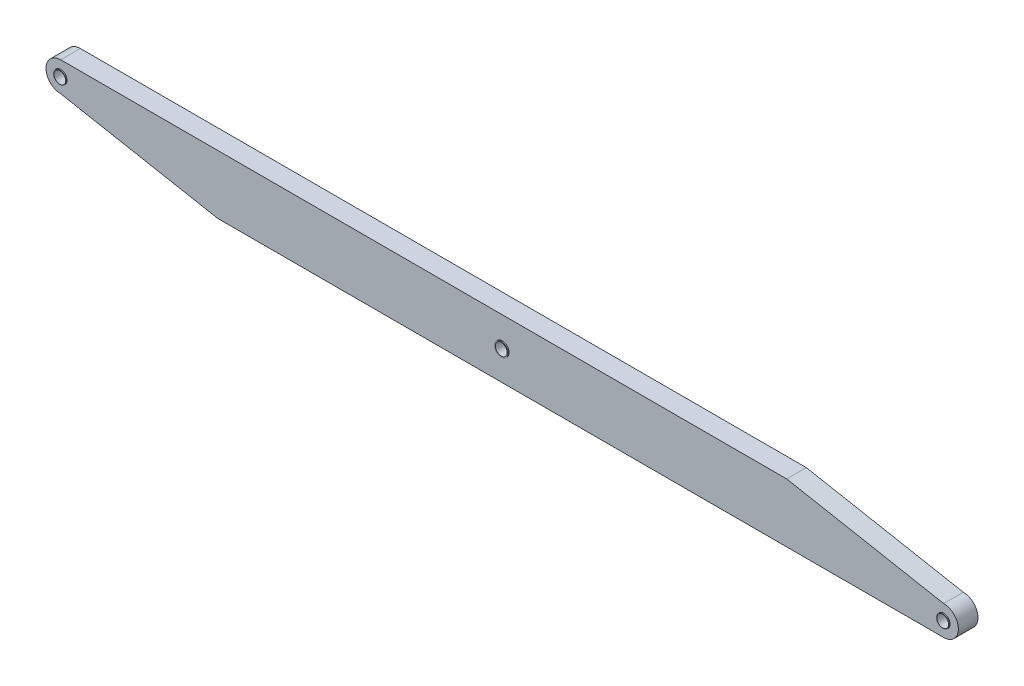
ISO-10303-21;
HEADER;
FILE_DESCRIPTION(('STEP AP214'),'2;1');
FILE_NAME('part.step','',(''),(''),'','','');
FILE_SCHEMA(('AUTOMOTIVE_DESIGN { 1 0 10303 214 1 1 1 1 }'));
ENDSEC;
DATA;
#1=APPLICATION_CONTEXT('core data for automotive mechanical design processes');
#2=APPLICATION_PROTOCOL_DEFINITION('international standard','automotive_design',2000,#1);
#3=PRODUCT_CONTEXT('',#1,'mechanical');
#4=PRODUCT('Part','Part','',(#3));
#5=PRODUCT_RELATED_PRODUCT_CATEGORY('part','',(#4));
#6=PRODUCT_DEFINITION_FORMATION('','',#4);
#7=PRODUCT_DEFINITION_CONTEXT('part definition',#1,'design');
#8=PRODUCT_DEFINITION('design','',#6,#7);
#9=PRODUCT_DEFINITION_SHAPE('','',#8);
#10=(LENGTH_UNIT() NAMED_UNIT(*) SI_UNIT(.MILLI.,.METRE.));
#11=(NAMED_UNIT(*) PLANE_ANGLE_UNIT() SI_UNIT($,.RADIAN.));
#12=(NAMED_UNIT(*) SI_UNIT($,.STERADIAN.) SOLID_ANGLE_UNIT());
#13=UNCERTAINTY_MEASURE_WITH_UNIT(LENGTH_MEASURE(1.E-05),#10,'distance_accuracy_value','');
#14=(GEOMETRIC_REPRESENTATION_CONTEXT(3) GLOBAL_UNCERTAINTY_ASSIGNED_CONTEXT((#13)) GLOBAL_UNIT_ASSIGNED_CONTEXT((#10,
#11,#12)) REPRESENTATION_CONTEXT('',''));
#15=CARTESIAN_POINT('',(0.,0.,0.));
#16=DIRECTION('',(0.,0.,1.));
#17=DIRECTION('',(1.,0.,0.));
#18=AXIS2_PLACEMENT_3D('',#15,#16,#17);
#19=CARTESIAN_POINT('',(1413.61764890017,-101.658248730964,67.25));
#20=DIRECTION('',(0.,0.,1.));
#21=DIRECTION('',(1.,0.,0.));
#22=AXIS2_PLACEMENT_3D('',#19,#20,#21);
#23=PLANE('',#22);
#24=CARTESIAN_POINT('',(2966.11764890017,-153.408248730964,67.25));
#25=DIRECTION('',(0.,0.,1.));
#26=DIRECTION('',(1.,0.,0.));
#27=AXIS2_PLACEMENT_3D('',#24,#25,#26);
#28=CIRCLE('',#27,11.2125);
#29=CARTESIAN_POINT('',(2977.33014890017,-153.408248730964,67.25));
#30=VERTEX_POINT('',#29);
#31=EDGE_CURVE('E228',#30,#30,#28,.T.);
#32=ORIENTED_EDGE('',*,*,#31,.F.);
#33=EDGE_LOOP('',(#32));
#34=FACE_BOUND('',#33,.T.);
#35=CARTESIAN_POINT('',(1413.61764890017,-101.658248730964,67.25));
#36=DIRECTION('',(0.,0.,1.));
#37=DIRECTION('',(1.,0.,0.));
#38=AXIS2_PLACEMENT_3D('',#35,#36,#37);
#39=CIRCLE('',#38,25.875);
#40=CARTESIAN_POINT('',(1413.61764890017,-75.7832487309645,67.25));
#41=VERTEX_POINT('',#40);
#42=CARTESIAN_POINT('',(1413.61764890017,-127.533248730964,67.25));
#43=VERTEX_POINT('',#42);
#44=EDGE_CURVE('E132',#41,#43,#39,.T.);
#45=ORIENTED_EDGE('',*,*,#44,.T.);
#46=DIRECTION('',(0.982872186934322,-0.184288535050185,0.));
#47=VECTOR('',#46,1.);
#48=CARTESIAN_POINT('',(1413.61764890017,-127.533248730964,67.25));
#49=LINE('',#48,#47);
#50=CARTESIAN_POINT('',(1689.61764890017,-179.283248730964,67.25));
#51=VERTEX_POINT('',#50);
#52=EDGE_CURVE('E90',#43,#51,#49,.T.);
#53=ORIENTED_EDGE('',*,*,#52,.T.);
#54=DIRECTION('',(1.,0.,0.));
#55=VECTOR('',#54,1.);
#56=CARTESIAN_POINT('',(1689.61764890017,-179.283248730964,67.25));
#57=LINE('',#56,#55);
#58=CARTESIAN_POINT('',(2966.11764890017,-179.283248730964,67.25));
#59=VERTEX_POINT('',#58);
#60=EDGE_CURVE('E103',#51,#59,#57,.T.);
#61=ORIENTED_EDGE('',*,*,#60,.T.);
#62=CARTESIAN_POINT('',(2966.11764890017,-153.408248730964,67.25));
#63=DIRECTION('',(0.,0.,1.));
#64=DIRECTION('',(1.,0.,0.));
#65=AXIS2_PLACEMENT_3D('',#62,#63,#64);
#66=CIRCLE('',#65,25.875);
#67=CARTESIAN_POINT('',(2966.11764890017,-127.533248730964,67.25));
#68=VERTEX_POINT('',#67);
#69=EDGE_CURVE('E97',#59,#68,#66,.T.);
#70=ORIENTED_EDGE('',*,*,#69,.T.);
#71=DIRECTION('',(-0.982872186934322,0.184288535050185,0.));
#72=VECTOR('',#71,1.);
#73=CARTESIAN_POINT('',(2966.11764890017,-127.533248730964,67.25));
#74=LINE('',#73,#72);
#75=CARTESIAN_POINT('',(2690.11764890017,-75.7832487309645,67.25));
#76=VERTEX_POINT('',#75);
#77=EDGE_CURVE('E101',#68,#76,#74,.T.);
#78=ORIENTED_EDGE('',*,*,#77,.T.);
#79=DIRECTION('',(-1.,0.,0.));
#80=VECTOR('',#79,1.);
#81=CARTESIAN_POINT('',(1413.61764890017,-75.7832487309645,67.25));
#82=LINE('',#81,#80);
#83=EDGE_CURVE('E52',#76,#41,#82,.T.);
#84=ORIENTED_EDGE('',*,*,#83,.T.);
#85=EDGE_LOOP('',(#45,#53,#61,#70,#78,#84));
#86=FACE_BOUND('',#85,.T.);
#87=CARTESIAN_POINT('',(1413.61764890017,-101.658248730964,67.25));
#88=DIRECTION('',(0.,0.,1.));
#89=DIRECTION('',(1.,0.,0.));
#90=AXIS2_PLACEMENT_3D('',#87,#88,#89);
#91=CIRCLE('',#90,11.2125);
#92=CARTESIAN_POINT('',(1424.83014890017,-101.658248730964,67.25));
#93=VERTEX_POINT('',#92);
#94=EDGE_CURVE('E219',#93,#93,#91,.T.);
#95=ORIENTED_EDGE('',*,*,#94,.F.);
#96=EDGE_LOOP('',(#95));
#97=FACE_BOUND('',#96,.T.);
#98=CARTESIAN_POINT('',(2189.86764890017,-127.533248730964,67.25));
#99=DIRECTION('',(0.,0.,1.));
#100=DIRECTION('',(1.,0.,0.));
#101=AXIS2_PLACEMENT_3D('',#98,#99,#100);
#102=CIRCLE('',#101,12.0749999999999);
#103=CARTESIAN_POINT('',(2201.94264890017,-127.533248730964,67.25));
#104=VERTEX_POINT('',#103);
#105=EDGE_CURVE('E243',#104,#104,#102,.T.);
#106=ORIENTED_EDGE('',*,*,#105,.F.);
#107=EDGE_LOOP('',(#106));
#108=FACE_BOUND('',#107,.T.);
#109=ADVANCED_FACE('F35',(#34,#86,#97,#108),#23,.T.);
#110=CARTESIAN_POINT('',(1413.61764890017,-101.658248730964,32.75));
#111=DIRECTION('',(0.,0.,1.));
#112=DIRECTION('',(1.,0.,0.));
#113=AXIS2_PLACEMENT_3D('',#110,#111,#112);
#114=PLANE('',#113);
#115=CARTESIAN_POINT('',(1413.61764890017,-101.658248730964,32.75));
#116=DIRECTION('',(0.,0.,1.));
#117=DIRECTION('',(1.,0.,0.));
#118=AXIS2_PLACEMENT_3D('',#115,#116,#117);
#119=CIRCLE('',#118,11.2125);
#120=CARTESIAN_POINT('',(1424.83014890017,-101.658248730964,32.75));
#121=VERTEX_POINT('',#120);
#122=EDGE_CURVE('E44',#121,#121,#119,.F.);
#123=ORIENTED_EDGE('',*,*,#122,.F.);
#124=EDGE_LOOP('',(#123));
#125=FACE_BOUND('',#124,.T.);
#126=CARTESIAN_POINT('',(1413.61764890017,-101.658248730964,32.75));
#127=DIRECTION('',(0.,0.,1.));
#128=DIRECTION('',(1.,0.,0.));
#129=AXIS2_PLACEMENT_3D('',#126,#127,#128);
#130=CIRCLE('',#129,25.875);
#131=CARTESIAN_POINT('',(1413.61764890017,-75.7832487309645,32.75));
#132=VERTEX_POINT('',#131);
#133=CARTESIAN_POINT('',(1413.61764890017,-127.533248730964,32.75));
#134=VERTEX_POINT('',#133);
#135=EDGE_CURVE('E121',#132,#134,#130,.T.);
#136=ORIENTED_EDGE('',*,*,#135,.F.);
#137=DIRECTION('',(-1.,0.,0.));
#138=VECTOR('',#137,1.);
#139=CARTESIAN_POINT('',(1413.61764890017,-75.7832487309645,32.75));
#140=LINE('',#139,#138);
#141=CARTESIAN_POINT('',(2690.11764890017,-75.7832487309645,32.75));
#142=VERTEX_POINT('',#141);
#143=EDGE_CURVE('E81',#142,#132,#140,.T.);
#144=ORIENTED_EDGE('',*,*,#143,.F.);
#145=DIRECTION('',(-0.982872186934322,0.184288535050185,0.));
#146=VECTOR('',#145,1.);
#147=CARTESIAN_POINT('',(2966.11764890017,-127.533248730964,32.75));
#148=LINE('',#147,#146);
#149=CARTESIAN_POINT('',(2966.11764890017,-127.533248730964,32.75));
#150=VERTEX_POINT('',#149);
#151=EDGE_CURVE('E75',#150,#142,#148,.T.);
#152=ORIENTED_EDGE('',*,*,#151,.F.);
#153=CARTESIAN_POINT('',(2966.11764890017,-153.408248730964,32.75));
#154=DIRECTION('',(0.,0.,1.));
#155=DIRECTION('',(1.,0.,0.));
#156=AXIS2_PLACEMENT_3D('',#153,#154,#155);
#157=CIRCLE('',#156,25.875);
#158=CARTESIAN_POINT('',(2966.11764890017,-179.283248730964,32.75));
#159=VERTEX_POINT('',#158);
#160=EDGE_CURVE('E111',#159,#150,#157,.T.);
#161=ORIENTED_EDGE('',*,*,#160,.F.);
#162=DIRECTION('',(1.,0.,0.));
#163=VECTOR('',#162,1.);
#164=CARTESIAN_POINT('',(1689.61764890017,-179.283248730964,32.75));
#165=LINE('',#164,#163);
#166=CARTESIAN_POINT('',(1689.61764890017,-179.283248730964,32.75));
#167=VERTEX_POINT('',#166);
#168=EDGE_CURVE('E127',#167,#159,#165,.T.);
#169=ORIENTED_EDGE('',*,*,#168,.F.);
#170=DIRECTION('',(0.982872186934322,-0.184288535050185,0.));
#171=VECTOR('',#170,1.);
#172=CARTESIAN_POINT('',(1413.61764890017,-127.533248730964,32.75));
#173=LINE('',#172,#171);
#174=EDGE_CURVE('E124',#134,#167,#173,.T.);
#175=ORIENTED_EDGE('',*,*,#174,.F.);
#176=EDGE_LOOP('',(#136,#144,#152,#161,#169,#175));
#177=FACE_BOUND('',#176,.T.);
#178=CARTESIAN_POINT('',(2966.11764890017,-153.408248730964,32.75));
#179=DIRECTION('',(0.,0.,1.));
#180=DIRECTION('',(1.,0.,0.));
#181=AXIS2_PLACEMENT_3D('',#178,#179,#180);
#182=CIRCLE('',#181,11.2125);
#183=CARTESIAN_POINT('',(2977.33014890017,-153.408248730964,32.75));
#184=VERTEX_POINT('',#183);
#185=EDGE_CURVE('E141',#184,#184,#182,.F.);
#186=ORIENTED_EDGE('',*,*,#185,.F.);
#187=EDGE_LOOP('',(#186));
#188=FACE_BOUND('',#187,.T.);
#189=CARTESIAN_POINT('',(2189.86764890017,-127.533248730964,32.75));
#190=DIRECTION('',(0.,0.,1.));
#191=DIRECTION('',(1.,0.,0.));
#192=AXIS2_PLACEMENT_3D('',#189,#190,#191);
#193=CIRCLE('',#192,12.0749999999999);
#194=CARTESIAN_POINT('',(2201.94264890017,-127.533248730964,32.75));
#195=VERTEX_POINT('',#194);
#196=EDGE_CURVE('E11',#195,#195,#193,.F.);
#197=ORIENTED_EDGE('',*,*,#196,.F.);
#198=EDGE_LOOP('',(#197));
#199=FACE_BOUND('',#198,.T.);
#200=ADVANCED_FACE('F148',(#125,#177,#188,#199),#114,.F.);
#201=CARTESIAN_POINT('',(1413.61764890017,-101.658248730964,67.25));
#202=DIRECTION('',(0.,0.,-1.));
#203=DIRECTION('',(-1.,0.,0.));
#204=AXIS2_PLACEMENT_3D('',#201,#202,#203);
#205=CYLINDRICAL_SURFACE('',#204,25.875);
#206=ORIENTED_EDGE('',*,*,#135,.T.);
#207=DIRECTION('',(0.,0.,-1.));
#208=VECTOR('',#207,1.);
#209=CARTESIAN_POINT('',(1413.61764890017,-127.533248730964,67.25));
#210=LINE('',#209,#208);
#211=EDGE_CURVE('E139',#43,#134,#210,.T.);
#212=ORIENTED_EDGE('',*,*,#211,.F.);
#213=ORIENTED_EDGE('',*,*,#44,.F.);
#214=DIRECTION('',(0.,0.,-1.));
#215=VECTOR('',#214,1.);
#216=CARTESIAN_POINT('',(1413.61764890017,-75.7832487309645,67.25));
#217=LINE('',#216,#215);
#218=EDGE_CURVE('E117',#41,#132,#217,.T.);
#219=ORIENTED_EDGE('',*,*,#218,.T.);
#220=EDGE_LOOP('',(#206,#212,#213,#219));
#221=FACE_BOUND('',#220,.T.);
#222=ADVANCED_FACE('F37',(#221),#205,.T.);
#223=CARTESIAN_POINT('',(1413.61764890017,-127.533248730964,67.25));
#224=DIRECTION('',(0.184288535050185,0.982872186934322,0.));
#225=DIRECTION('',(-0.982872186934322,0.184288535050185,0.));
#226=AXIS2_PLACEMENT_3D('',#223,#224,#225);
#227=PLANE('',#226);
#228=ORIENTED_EDGE('',*,*,#174,.T.);
#229=DIRECTION('',(0.,0.,-1.));
#230=VECTOR('',#229,1.);
#231=CARTESIAN_POINT('',(1689.61764890017,-179.283248730964,67.25));
#232=LINE('',#231,#230);
#233=EDGE_CURVE('E136',#51,#167,#232,.T.);
#234=ORIENTED_EDGE('',*,*,#233,.F.);
#235=ORIENTED_EDGE('',*,*,#52,.F.);
#236=ORIENTED_EDGE('',*,*,#211,.T.);
#237=EDGE_LOOP('',(#228,#234,#235,#236));
#238=FACE_BOUND('',#237,.T.);
#239=ADVANCED_FACE('F195',(#238),#227,.F.);
#240=CARTESIAN_POINT('',(1689.61764890017,-179.283248730964,67.25));
#241=DIRECTION('',(0.,1.,0.));
#242=DIRECTION('',(0.,0.,1.));
#243=AXIS2_PLACEMENT_3D('',#240,#241,#242);
#244=PLANE('',#243);
#245=ORIENTED_EDGE('',*,*,#168,.T.);
#246=DIRECTION('',(0.,0.,-1.));
#247=VECTOR('',#246,1.);
#248=CARTESIAN_POINT('',(2966.11764890017,-179.283248730964,67.25));
#249=LINE('',#248,#247);
#250=EDGE_CURVE('E112',#59,#159,#249,.T.);
#251=ORIENTED_EDGE('',*,*,#250,.F.);
#252=ORIENTED_EDGE('',*,*,#60,.F.);
#253=ORIENTED_EDGE('',*,*,#233,.T.);
#254=EDGE_LOOP('',(#245,#251,#252,#253));
#255=FACE_BOUND('',#254,.T.);
#256=ADVANCED_FACE('F193',(#255),#244,.F.);
#257=CARTESIAN_POINT('',(2966.11764890017,-153.408248730964,67.25));
#258=DIRECTION('',(0.,0.,-1.));
#259=DIRECTION('',(-1.,0.,0.));
#260=AXIS2_PLACEMENT_3D('',#257,#258,#259);
#261=CYLINDRICAL_SURFACE('',#260,25.875);
#262=ORIENTED_EDGE('',*,*,#160,.T.);
#263=DIRECTION('',(0.,0.,-1.));
#264=VECTOR('',#263,1.);
#265=CARTESIAN_POINT('',(2966.11764890017,-127.533248730964,67.25));
#266=LINE('',#265,#264);
#267=EDGE_CURVE('E108',#68,#150,#266,.T.);
#268=ORIENTED_EDGE('',*,*,#267,.F.);
#269=ORIENTED_EDGE('',*,*,#69,.F.);
#270=ORIENTED_EDGE('',*,*,#250,.T.);
#271=EDGE_LOOP('',(#262,#268,#269,#270));
#272=FACE_BOUND('',#271,.T.);
#273=ADVANCED_FACE('F109',(#272),#261,.T.);
#274=CARTESIAN_POINT('',(2966.11764890017,-127.533248730964,67.25));
#275=DIRECTION('',(-0.184288535050185,-0.982872186934322,0.));
#276=DIRECTION('',(0.982872186934322,-0.184288535050185,0.));
#277=AXIS2_PLACEMENT_3D('',#274,#275,#276);
#278=PLANE('',#277);
#279=ORIENTED_EDGE('',*,*,#151,.T.);
#280=DIRECTION('',(0.,0.,-1.));
#281=VECTOR('',#280,1.);
#282=CARTESIAN_POINT('',(2690.11764890017,-75.7832487309645,67.25));
#283=LINE('',#282,#281);
#284=EDGE_CURVE('E113',#76,#142,#283,.T.);
#285=ORIENTED_EDGE('',*,*,#284,.F.);
#286=ORIENTED_EDGE('',*,*,#77,.F.);
#287=ORIENTED_EDGE('',*,*,#267,.T.);
#288=EDGE_LOOP('',(#279,#285,#286,#287));
#289=FACE_BOUND('',#288,.T.);
#290=ADVANCED_FACE('F115',(#289),#278,.F.);
#291=CARTESIAN_POINT('',(1413.61764890017,-75.7832487309645,67.25));
#292=DIRECTION('',(0.,-1.,0.));
#293=DIRECTION('',(1.,0.,0.));
#294=AXIS2_PLACEMENT_3D('',#291,#292,#293);
#295=PLANE('',#294);
#296=ORIENTED_EDGE('',*,*,#143,.T.);
#297=ORIENTED_EDGE('',*,*,#218,.F.);
#298=ORIENTED_EDGE('',*,*,#83,.F.);
#299=ORIENTED_EDGE('',*,*,#284,.T.);
#300=EDGE_LOOP('',(#296,#297,#298,#299));
#301=FACE_BOUND('',#300,.T.);
#302=ADVANCED_FACE('F186',(#301),#295,.F.);
#303=CARTESIAN_POINT('',(1413.61764890017,-101.658248730964,32.75));
#304=DIRECTION('',(0.,0.,1.));
#305=DIRECTION('',(1.,0.,0.));
#306=AXIS2_PLACEMENT_3D('',#303,#304,#305);
#307=CYLINDRICAL_SURFACE('',#306,10.35);
#308=CARTESIAN_POINT('',(1413.61764890017,-101.658248730964,31.025));
#309=DIRECTION('',(0.,0.,-1.));
#310=DIRECTION('',(-1.,0.,0.));
#311=AXIS2_PLACEMENT_3D('',#308,#309,#310);
#312=CIRCLE('',#311,10.35);
#313=CARTESIAN_POINT('',(1403.26764890017,-101.658248730964,31.025));
#314=VERTEX_POINT('',#313);
#315=EDGE_CURVE('E215',#314,#314,#312,.T.);
#316=ORIENTED_EDGE('',*,*,#315,.T.);
#317=EDGE_LOOP('',(#316));
#318=FACE_BOUND('',#317,.T.);
#319=CARTESIAN_POINT('',(1413.61764890017,-101.658248730964,68.975));
#320=DIRECTION('',(0.,0.,1.));
#321=DIRECTION('',(1.,0.,0.));
#322=AXIS2_PLACEMENT_3D('',#319,#320,#321);
#323=CIRCLE('',#322,10.35);
#324=CARTESIAN_POINT('',(1423.96764890017,-101.658248730964,68.975));
#325=VERTEX_POINT('',#324);
#326=EDGE_CURVE('E222',#325,#325,#323,.T.);
#327=ORIENTED_EDGE('',*,*,#326,.T.);
#328=EDGE_LOOP('',(#327));
#329=FACE_BOUND('',#328,.T.);
#330=ADVANCED_FACE('F183',(#318,#329),#307,.F.);
#331=CARTESIAN_POINT('',(2966.11764890017,-153.408248730964,32.75));
#332=DIRECTION('',(0.,0.,1.));
#333=DIRECTION('',(1.,0.,0.));
#334=AXIS2_PLACEMENT_3D('',#331,#332,#333);
#335=CYLINDRICAL_SURFACE('',#334,10.3499999999999);
#336=CARTESIAN_POINT('',(2966.11764890017,-153.408248730964,31.025));
#337=DIRECTION('',(0.,0.,-1.));
#338=DIRECTION('',(-1.,0.,0.));
#339=AXIS2_PLACEMENT_3D('',#336,#337,#338);
#340=CIRCLE('',#339,10.35);
#341=CARTESIAN_POINT('',(2955.76764890017,-153.408248730964,31.025));
#342=VERTEX_POINT('',#341);
#343=EDGE_CURVE('E209',#342,#342,#340,.T.);
#344=ORIENTED_EDGE('',*,*,#343,.T.);
#345=EDGE_LOOP('',(#344));
#346=FACE_BOUND('',#345,.T.);
#347=CARTESIAN_POINT('',(2966.11764890017,-153.408248730964,68.975));
#348=DIRECTION('',(0.,0.,1.));
#349=DIRECTION('',(1.,0.,0.));
#350=AXIS2_PLACEMENT_3D('',#347,#348,#349);
#351=CIRCLE('',#350,10.35);
#352=CARTESIAN_POINT('',(2976.46764890017,-153.408248730964,68.975));
#353=VERTEX_POINT('',#352);
#354=EDGE_CURVE('E231',#353,#353,#351,.T.);
#355=ORIENTED_EDGE('',*,*,#354,.T.);
#356=EDGE_LOOP('',(#355));
#357=FACE_BOUND('',#356,.T.);
#358=ADVANCED_FACE('F285',(#346,#357),#335,.F.);
#359=CARTESIAN_POINT('',(2966.11764890017,-153.408248730964,31.025));
#360=DIRECTION('',(0.,0.,-1.));
#361=DIRECTION('',(-1.,0.,0.));
#362=AXIS2_PLACEMENT_3D('',#359,#360,#361);
#363=PLANE('',#362);
#364=CARTESIAN_POINT('',(2966.11764890017,-153.408248730964,31.025));
#365=DIRECTION('',(0.,0.,-1.));
#366=DIRECTION('',(-1.,0.,0.));
#367=AXIS2_PLACEMENT_3D('',#364,#365,#366);
#368=CIRCLE('',#367,11.2125);
#369=CARTESIAN_POINT('',(2954.90514890017,-153.408248730964,31.025));
#370=VERTEX_POINT('',#369);
#371=EDGE_CURVE('E125',#370,#370,#368,.T.);
#372=ORIENTED_EDGE('',*,*,#371,.T.);
#373=EDGE_LOOP('',(#372));
#374=FACE_BOUND('',#373,.T.);
#375=ORIENTED_EDGE('',*,*,#343,.F.);
#376=EDGE_LOOP('',(#375));
#377=FACE_BOUND('',#376,.T.);
#378=ADVANCED_FACE('F282',(#374,#377),#363,.T.);
#379=CARTESIAN_POINT('',(2966.11764890017,-153.408248730964,31.025));
#380=DIRECTION('',(0.,0.,1.));
#381=DIRECTION('',(1.,0.,0.));
#382=AXIS2_PLACEMENT_3D('',#379,#380,#381);
#383=CYLINDRICAL_SURFACE('',#382,11.2125);
#384=ORIENTED_EDGE('',*,*,#371,.F.);
#385=EDGE_LOOP('',(#384));
#386=FACE_BOUND('',#385,.T.);
#387=ORIENTED_EDGE('',*,*,#185,.T.);
#388=EDGE_LOOP('',(#387));
#389=FACE_BOUND('',#388,.T.);
#390=ADVANCED_FACE('F277',(#386,#389),#383,.T.);
#391=CARTESIAN_POINT('',(1413.61764890017,-101.658248730964,31.025));
#392=DIRECTION('',(0.,0.,-1.));
#393=DIRECTION('',(-1.,0.,0.));
#394=AXIS2_PLACEMENT_3D('',#391,#392,#393);
#395=PLANE('',#394);
#396=CARTESIAN_POINT('',(1413.61764890017,-101.658248730964,31.025));
#397=DIRECTION('',(0.,0.,-1.));
#398=DIRECTION('',(-1.,0.,0.));
#399=AXIS2_PLACEMENT_3D('',#396,#397,#398);
#400=CIRCLE('',#399,11.2125);
#401=CARTESIAN_POINT('',(1402.40514890017,-101.658248730964,31.025));
#402=VERTEX_POINT('',#401);
#403=EDGE_CURVE('E212',#402,#402,#400,.T.);
#404=ORIENTED_EDGE('',*,*,#403,.T.);
#405=EDGE_LOOP('',(#404));
#406=FACE_BOUND('',#405,.T.);
#407=ORIENTED_EDGE('',*,*,#315,.F.);
#408=EDGE_LOOP('',(#407));
#409=FACE_BOUND('',#408,.T.);
#410=ADVANCED_FACE('F274',(#406,#409),#395,.T.);
#411=CARTESIAN_POINT('',(1413.61764890017,-101.658248730964,31.025));
#412=DIRECTION('',(0.,0.,1.));
#413=DIRECTION('',(1.,0.,0.));
#414=AXIS2_PLACEMENT_3D('',#411,#412,#413);
#415=CYLINDRICAL_SURFACE('',#414,11.2125);
#416=ORIENTED_EDGE('',*,*,#403,.F.);
#417=EDGE_LOOP('',(#416));
#418=FACE_BOUND('',#417,.T.);
#419=ORIENTED_EDGE('',*,*,#122,.T.);
#420=EDGE_LOOP('',(#419));
#421=FACE_BOUND('',#420,.T.);
#422=ADVANCED_FACE('F146',(#418,#421),#415,.T.);
#423=CARTESIAN_POINT('',(1413.61764890017,-101.658248730964,68.975));
#424=DIRECTION('',(0.,0.,1.));
#425=DIRECTION('',(1.,0.,0.));
#426=AXIS2_PLACEMENT_3D('',#423,#424,#425);
#427=PLANE('',#426);
#428=CARTESIAN_POINT('',(1413.61764890017,-101.658248730964,68.975));
#429=DIRECTION('',(0.,0.,1.));
#430=DIRECTION('',(1.,0.,0.));
#431=AXIS2_PLACEMENT_3D('',#428,#429,#430);
#432=CIRCLE('',#431,11.2125);
#433=CARTESIAN_POINT('',(1424.83014890017,-101.658248730964,68.975));
#434=VERTEX_POINT('',#433);
#435=EDGE_CURVE('E218',#434,#434,#432,.T.);
#436=ORIENTED_EDGE('',*,*,#435,.T.);
#437=EDGE_LOOP('',(#436));
#438=FACE_BOUND('',#437,.T.);
#439=ORIENTED_EDGE('',*,*,#326,.F.);
#440=EDGE_LOOP('',(#439));
#441=FACE_BOUND('',#440,.T.);
#442=ADVANCED_FACE('F267',(#438,#441),#427,.T.);
#443=CARTESIAN_POINT('',(1413.61764890017,-101.658248730964,68.975));
#444=DIRECTION('',(0.,0.,-1.));
#445=DIRECTION('',(-1.,0.,0.));
#446=AXIS2_PLACEMENT_3D('',#443,#444,#445);
#447=CYLINDRICAL_SURFACE('',#446,11.2125);
#448=ORIENTED_EDGE('',*,*,#435,.F.);
#449=EDGE_LOOP('',(#448));
#450=FACE_BOUND('',#449,.T.);
#451=ORIENTED_EDGE('',*,*,#94,.T.);
#452=EDGE_LOOP('',(#451));
#453=FACE_BOUND('',#452,.T.);
#454=ADVANCED_FACE('F264',(#450,#453),#447,.T.);
#455=CARTESIAN_POINT('',(2966.11764890017,-153.408248730964,68.975));
#456=DIRECTION('',(0.,0.,1.));
#457=DIRECTION('',(1.,0.,0.));
#458=AXIS2_PLACEMENT_3D('',#455,#456,#457);
#459=PLANE('',#458);
#460=CARTESIAN_POINT('',(2966.11764890017,-153.408248730964,68.975));
#461=DIRECTION('',(0.,0.,1.));
#462=DIRECTION('',(1.,0.,0.));
#463=AXIS2_PLACEMENT_3D('',#460,#461,#462);
#464=CIRCLE('',#463,11.2125);
#465=CARTESIAN_POINT('',(2977.33014890017,-153.408248730964,68.975));
#466=VERTEX_POINT('',#465);
#467=EDGE_CURVE('E227',#466,#466,#464,.T.);
#468=ORIENTED_EDGE('',*,*,#467,.T.);
#469=EDGE_LOOP('',(#468));
#470=FACE_BOUND('',#469,.T.);
#471=ORIENTED_EDGE('',*,*,#354,.F.);
#472=EDGE_LOOP('',(#471));
#473=FACE_BOUND('',#472,.T.);
#474=ADVANCED_FACE('F259',(#470,#473),#459,.T.);
#475=CARTESIAN_POINT('',(2966.11764890017,-153.408248730964,68.975));
#476=DIRECTION('',(0.,0.,-1.));
#477=DIRECTION('',(-1.,0.,0.));
#478=AXIS2_PLACEMENT_3D('',#475,#476,#477);
#479=CYLINDRICAL_SURFACE('',#478,11.2125);
#480=ORIENTED_EDGE('',*,*,#467,.F.);
#481=EDGE_LOOP('',(#480));
#482=FACE_BOUND('',#481,.T.);
#483=ORIENTED_EDGE('',*,*,#31,.T.);
#484=EDGE_LOOP('',(#483));
#485=FACE_BOUND('',#484,.T.);
#486=ADVANCED_FACE('F254',(#482,#485),#479,.T.);
#487=CARTESIAN_POINT('',(2189.86764890017,-127.533248730964,118.31));
#488=DIRECTION('',(0.,0.,-1.));
#489=DIRECTION('',(-1.,0.,0.));
#490=AXIS2_PLACEMENT_3D('',#487,#488,#489);
#491=CYLINDRICAL_SURFACE('',#490,10.3499999999999);
#492=CARTESIAN_POINT('',(2189.86764890017,-127.533248730964,31.025));
#493=DIRECTION('',(0.,0.,-1.));
#494=DIRECTION('',(-1.,0.,0.));
#495=AXIS2_PLACEMENT_3D('',#492,#493,#494);
#496=CIRCLE('',#495,10.3499999999999);
#497=CARTESIAN_POINT('',(2179.51764890017,-127.533248730964,31.025));
#498=VERTEX_POINT('',#497);
#499=EDGE_CURVE('E239',#498,#498,#496,.T.);
#500=ORIENTED_EDGE('',*,*,#499,.T.);
#501=EDGE_LOOP('',(#500));
#502=FACE_BOUND('',#501,.T.);
#503=CARTESIAN_POINT('',(2189.86764890017,-127.533248730964,68.975));
#504=DIRECTION('',(0.,0.,1.));
#505=DIRECTION('',(1.,0.,0.));
#506=AXIS2_PLACEMENT_3D('',#503,#504,#505);
#507=CIRCLE('',#506,10.3499999999999);
#508=CARTESIAN_POINT('',(2200.21764890017,-127.533248730964,68.975));
#509=VERTEX_POINT('',#508);
#510=EDGE_CURVE('E246',#509,#509,#507,.T.);
#511=ORIENTED_EDGE('',*,*,#510,.T.);
#512=EDGE_LOOP('',(#511));
#513=FACE_BOUND('',#512,.T.);
#514=ADVANCED_FACE('F171',(#502,#513),#491,.F.);
#515=CARTESIAN_POINT('',(2189.86764890017,-127.533248730964,31.025));
#516=DIRECTION('',(0.,0.,-1.));
#517=DIRECTION('',(-1.,0.,0.));
#518=AXIS2_PLACEMENT_3D('',#515,#516,#517);
#519=PLANE('',#518);
#520=CARTESIAN_POINT('',(2189.86764890017,-127.533248730964,31.025));
#521=DIRECTION('',(0.,0.,-1.));
#522=DIRECTION('',(-1.,0.,0.));
#523=AXIS2_PLACEMENT_3D('',#520,#521,#522);
#524=CIRCLE('',#523,12.0749999999999);
#525=CARTESIAN_POINT('',(2177.79264890017,-127.533248730964,31.025));
#526=VERTEX_POINT('',#525);
#527=EDGE_CURVE('E236',#526,#526,#524,.T.);
#528=ORIENTED_EDGE('',*,*,#527,.T.);
#529=EDGE_LOOP('',(#528));
#530=FACE_BOUND('',#529,.T.);
#531=ORIENTED_EDGE('',*,*,#499,.F.);
#532=EDGE_LOOP('',(#531));
#533=FACE_BOUND('',#532,.T.);
#534=ADVANCED_FACE('F161',(#530,#533),#519,.T.);
#535=CARTESIAN_POINT('',(2189.86764890017,-127.533248730964,31.025));
#536=DIRECTION('',(0.,0.,1.));
#537=DIRECTION('',(1.,0.,0.));
#538=AXIS2_PLACEMENT_3D('',#535,#536,#537);
#539=CYLINDRICAL_SURFACE('',#538,12.0749999999999);
#540=ORIENTED_EDGE('',*,*,#527,.F.);
#541=EDGE_LOOP('',(#540));
#542=FACE_BOUND('',#541,.T.);
#543=ORIENTED_EDGE('',*,*,#196,.T.);
#544=EDGE_LOOP('',(#543));
#545=FACE_BOUND('',#544,.T.);
#546=ADVANCED_FACE('F158',(#542,#545),#539,.T.);
#547=CARTESIAN_POINT('',(2189.86764890017,-127.533248730964,68.975));
#548=DIRECTION('',(0.,0.,1.));
#549=DIRECTION('',(1.,0.,0.));
#550=AXIS2_PLACEMENT_3D('',#547,#548,#549);
#551=PLANE('',#550);
#552=CARTESIAN_POINT('',(2189.86764890017,-127.533248730964,68.975));
#553=DIRECTION('',(0.,0.,1.));
#554=DIRECTION('',(1.,0.,0.));
#555=AXIS2_PLACEMENT_3D('',#552,#553,#554);
#556=CIRCLE('',#555,12.0749999999999);
#557=CARTESIAN_POINT('',(2201.94264890017,-127.533248730964,68.975));
#558=VERTEX_POINT('',#557);
#559=EDGE_CURVE('E242',#558,#558,#556,.T.);
#560=ORIENTED_EDGE('',*,*,#559,.T.);
#561=EDGE_LOOP('',(#560));
#562=FACE_BOUND('',#561,.T.);
#563=ORIENTED_EDGE('',*,*,#510,.F.);
#564=EDGE_LOOP('',(#563));
#565=FACE_BOUND('',#564,.T.);
#566=ADVANCED_FACE('F160',(#562,#565),#551,.T.);
#567=CARTESIAN_POINT('',(2189.86764890017,-127.533248730964,68.975));
#568=DIRECTION('',(0.,0.,-1.));
#569=DIRECTION('',(-1.,0.,0.));
#570=AXIS2_PLACEMENT_3D('',#567,#568,#569);
#571=CYLINDRICAL_SURFACE('',#570,12.0749999999999);
#572=ORIENTED_EDGE('',*,*,#559,.F.);
#573=EDGE_LOOP('',(#572));
#574=FACE_BOUND('',#573,.T.);
#575=ORIENTED_EDGE('',*,*,#105,.T.);
#576=EDGE_LOOP('',(#575));
#577=FACE_BOUND('',#576,.T.);
#578=ADVANCED_FACE('F168',(#574,#577),#571,.T.);
#579=CLOSED_SHELL('',(#109,#200,#222,#239,#256,#273,#290,#302,#330,#358,#378,#390,#410,#422,
#442,#454,#474,#486,#514,#534,#546,#566,#578));
#580=MANIFOLD_SOLID_BREP('B2',#579);
#581=ADVANCED_BREP_SHAPE_REPRESENTATION('',(#18,#580),#14);
#582=SHAPE_DEFINITION_REPRESENTATION(#9,#581);
ENDSEC;
END-ISO-10303-21;
